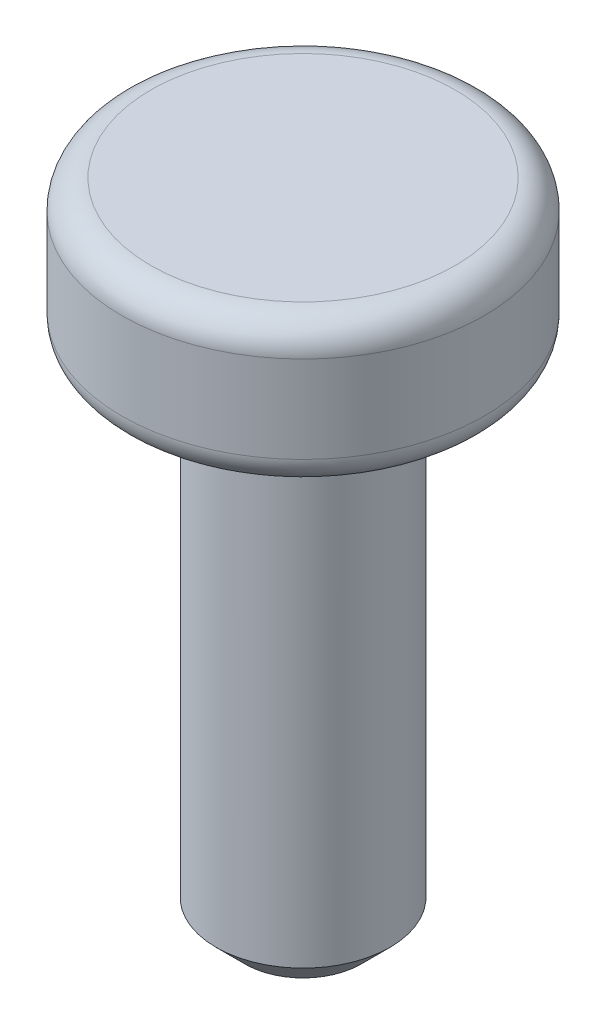
ISO-10303-21;
HEADER;
FILE_DESCRIPTION(('STEP AP214'),'2;1');
FILE_NAME('part.step','',(''),(''),'','','');
FILE_SCHEMA(('AUTOMOTIVE_DESIGN { 1 0 10303 214 1 1 1 1 }'));
ENDSEC;
DATA;
#1=APPLICATION_CONTEXT('core data for automotive mechanical design processes');
#2=APPLICATION_PROTOCOL_DEFINITION('international standard','automotive_design',2000,#1);
#3=PRODUCT_CONTEXT('',#1,'mechanical');
#4=PRODUCT('Part','Part','',(#3));
#5=PRODUCT_RELATED_PRODUCT_CATEGORY('part','',(#4));
#6=PRODUCT_DEFINITION_FORMATION('','',#4);
#7=PRODUCT_DEFINITION_CONTEXT('part definition',#1,'design');
#8=PRODUCT_DEFINITION('design','',#6,#7);
#9=PRODUCT_DEFINITION_SHAPE('','',#8);
#10=(LENGTH_UNIT() NAMED_UNIT(*) SI_UNIT(.MILLI.,.METRE.));
#11=(NAMED_UNIT(*) PLANE_ANGLE_UNIT() SI_UNIT($,.RADIAN.));
#12=(NAMED_UNIT(*) SI_UNIT($,.STERADIAN.) SOLID_ANGLE_UNIT());
#13=UNCERTAINTY_MEASURE_WITH_UNIT(LENGTH_MEASURE(1.E-05),#10,'distance_accuracy_value','');
#14=(GEOMETRIC_REPRESENTATION_CONTEXT(3) GLOBAL_UNCERTAINTY_ASSIGNED_CONTEXT((#13)) GLOBAL_UNIT_ASSIGNED_CONTEXT((#10,
#11,#12)) REPRESENTATION_CONTEXT('',''));
#15=CARTESIAN_POINT('',(0.,0.,0.));
#16=DIRECTION('',(0.,0.,1.));
#17=DIRECTION('',(1.,0.,0.));
#18=AXIS2_PLACEMENT_3D('',#15,#16,#17);
#19=CARTESIAN_POINT('',(0.,0.,0.));
#20=DIRECTION('',(0.,1.,0.));
#21=DIRECTION('',(0.,0.,1.));
#22=AXIS2_PLACEMENT_3D('',#19,#20,#21);
#23=PLANE('',#22);
#24=CARTESIAN_POINT('',(0.,0.,0.));
#25=DIRECTION('',(0.,1.,0.));
#26=DIRECTION('',(0.,0.,1.));
#27=AXIS2_PLACEMENT_3D('',#24,#25,#26);
#28=CIRCLE('',#27,1.05);
#29=CARTESIAN_POINT('',(0.,0.,1.05));
#30=VERTEX_POINT('',#29);
#31=EDGE_CURVE('E34',#30,#30,#28,.F.);
#32=ORIENTED_EDGE('',*,*,#31,.T.);
#33=EDGE_LOOP('',(#32));
#34=FACE_BOUND('',#33,.T.);
#35=CARTESIAN_POINT('',(0.,0.,0.));
#36=DIRECTION('',(0.,1.,0.));
#37=DIRECTION('',(0.,0.,1.));
#38=AXIS2_PLACEMENT_3D('',#35,#36,#37);
#39=CIRCLE('',#38,0.6);
#40=CARTESIAN_POINT('',(0.,0.,0.6));
#41=VERTEX_POINT('',#40);
#42=EDGE_CURVE('E25',#41,#41,#39,.F.);
#43=ORIENTED_EDGE('',*,*,#42,.F.);
#44=EDGE_LOOP('',(#43));
#45=FACE_BOUND('',#44,.T.);
#46=ADVANCED_FACE('F14',(#34,#45),#23,.F.);
#47=CARTESIAN_POINT('',(0.,1.,0.));
#48=DIRECTION('',(0.,-1.,0.));
#49=DIRECTION('',(0.,0.,-1.));
#50=AXIS2_PLACEMENT_3D('',#47,#48,#49);
#51=CYLINDRICAL_SURFACE('',#50,1.25);
#52=CARTESIAN_POINT('',(0.,0.2,0.));
#53=DIRECTION('',(0.,1.,0.));
#54=DIRECTION('',(0.,0.,1.));
#55=AXIS2_PLACEMENT_3D('',#52,#53,#54);
#56=CIRCLE('',#55,1.25);
#57=CARTESIAN_POINT('',(0.,0.2,1.25));
#58=VERTEX_POINT('',#57);
#59=EDGE_CURVE('E37',#58,#58,#56,.T.);
#60=ORIENTED_EDGE('',*,*,#59,.T.);
#61=EDGE_LOOP('',(#60));
#62=FACE_BOUND('',#61,.T.);
#63=CARTESIAN_POINT('',(0.,0.8,0.));
#64=DIRECTION('',(0.,1.,0.));
#65=DIRECTION('',(0.,0.,1.));
#66=AXIS2_PLACEMENT_3D('',#63,#64,#65);
#67=CIRCLE('',#66,1.25);
#68=CARTESIAN_POINT('',(0.,0.8,1.25));
#69=VERTEX_POINT('',#68);
#70=EDGE_CURVE('E40',#69,#69,#67,.F.);
#71=ORIENTED_EDGE('',*,*,#70,.T.);
#72=EDGE_LOOP('',(#71));
#73=FACE_BOUND('',#72,.T.);
#74=ADVANCED_FACE('F44',(#62,#73),#51,.T.);
#75=CARTESIAN_POINT('',(0.,1.,0.));
#76=DIRECTION('',(0.,1.,0.));
#77=DIRECTION('',(0.,0.,1.));
#78=AXIS2_PLACEMENT_3D('',#75,#76,#77);
#79=PLANE('',#78);
#80=CARTESIAN_POINT('',(0.,1.,0.));
#81=DIRECTION('',(0.,1.,0.));
#82=DIRECTION('',(0.,0.,1.));
#83=AXIS2_PLACEMENT_3D('',#80,#81,#82);
#84=CIRCLE('',#83,1.05);
#85=CARTESIAN_POINT('',(0.,1.,1.05));
#86=VERTEX_POINT('',#85);
#87=EDGE_CURVE('E29',#86,#86,#84,.T.);
#88=ORIENTED_EDGE('',*,*,#87,.T.);
#89=EDGE_LOOP('',(#88));
#90=FACE_BOUND('',#89,.T.);
#91=ADVANCED_FACE('F53',(#90),#79,.T.);
#92=CARTESIAN_POINT('',(0.,0.2,0.));
#93=DIRECTION('',(0.,1.,0.));
#94=DIRECTION('',(0.,0.,1.));
#95=AXIS2_PLACEMENT_3D('',#92,#93,#94);
#96=TOROIDAL_SURFACE('',#95,1.05,0.2);
#97=ORIENTED_EDGE('',*,*,#31,.F.);
#98=EDGE_LOOP('',(#97));
#99=FACE_BOUND('',#98,.T.);
#100=ORIENTED_EDGE('',*,*,#59,.F.);
#101=EDGE_LOOP('',(#100));
#102=FACE_BOUND('',#101,.T.);
#103=ADVANCED_FACE('F50',(#99,#102),#96,.T.);
#104=CARTESIAN_POINT('',(0.,0.8,0.));
#105=DIRECTION('',(0.,1.,0.));
#106=DIRECTION('',(0.,0.,1.));
#107=AXIS2_PLACEMENT_3D('',#104,#105,#106);
#108=TOROIDAL_SURFACE('',#107,1.05,0.2);
#109=ORIENTED_EDGE('',*,*,#70,.F.);
#110=EDGE_LOOP('',(#109));
#111=FACE_BOUND('',#110,.T.);
#112=ORIENTED_EDGE('',*,*,#87,.F.);
#113=EDGE_LOOP('',(#112));
#114=FACE_BOUND('',#113,.T.);
#115=ADVANCED_FACE('F46',(#111,#114),#108,.T.);
#116=CARTESIAN_POINT('',(0.,-3.5,0.));
#117=DIRECTION('',(0.,1.,0.));
#118=DIRECTION('',(0.,0.,1.));
#119=AXIS2_PLACEMENT_3D('',#116,#117,#118);
#120=CYLINDRICAL_SURFACE('',#119,0.6);
#121=CARTESIAN_POINT('',(0.,-3.3,0.));
#122=DIRECTION('',(0.,-1.,0.));
#123=DIRECTION('',(0.,0.,-1.));
#124=AXIS2_PLACEMENT_3D('',#121,#122,#123);
#125=CIRCLE('',#124,0.6);
#126=CARTESIAN_POINT('',(0.,-3.3,-0.6));
#127=VERTEX_POINT('',#126);
#128=EDGE_CURVE('E10',#127,#127,#125,.F.);
#129=ORIENTED_EDGE('',*,*,#128,.T.);
#130=EDGE_LOOP('',(#129));
#131=FACE_BOUND('',#130,.T.);
#132=ORIENTED_EDGE('',*,*,#42,.T.);
#133=EDGE_LOOP('',(#132));
#134=FACE_BOUND('',#133,.T.);
#135=ADVANCED_FACE('F49',(#131,#134),#120,.T.);
#136=CARTESIAN_POINT('',(0.,-3.5,0.));
#137=DIRECTION('',(0.,-1.,0.));
#138=DIRECTION('',(0.,0.,-1.));
#139=AXIS2_PLACEMENT_3D('',#136,#137,#138);
#140=PLANE('',#139);
#141=CARTESIAN_POINT('',(0.,-3.5,0.));
#142=DIRECTION('',(0.,-1.,0.));
#143=DIRECTION('',(0.,0.,-1.));
#144=AXIS2_PLACEMENT_3D('',#141,#142,#143);
#145=CIRCLE('',#144,0.4);
#146=CARTESIAN_POINT('',(0.,-3.5,-0.4));
#147=VERTEX_POINT('',#146);
#148=EDGE_CURVE('E21',#147,#147,#145,.T.);
#149=ORIENTED_EDGE('',*,*,#148,.T.);
#150=EDGE_LOOP('',(#149));
#151=FACE_BOUND('',#150,.T.);
#152=ADVANCED_FACE('F78',(#151),#140,.T.);
#153=CARTESIAN_POINT('',(0.,-3.5,0.));
#154=DIRECTION('',(0.,1.,0.));
#155=DIRECTION('',(0.,0.,1.));
#156=AXIS2_PLACEMENT_3D('',#153,#154,#155);
#157=CONICAL_SURFACE('',#156,0.4,0.785398163397449);
#158=ORIENTED_EDGE('',*,*,#128,.F.);
#159=EDGE_LOOP('',(#158));
#160=FACE_BOUND('',#159,.T.);
#161=ORIENTED_EDGE('',*,*,#148,.F.);
#162=EDGE_LOOP('',(#161));
#163=FACE_BOUND('',#162,.T.);
#164=ADVANCED_FACE('F16',(#160,#163),#157,.T.);
#165=CLOSED_SHELL('',(#46,#74,#91,#103,#115,#135,#152,#164));
#166=MANIFOLD_SOLID_BREP('B1',#165);
#167=ADVANCED_BREP_SHAPE_REPRESENTATION('',(#18,#166),#14);
#168=SHAPE_DEFINITION_REPRESENTATION(#9,#167);
ENDSEC;
END-ISO-10303-21;
